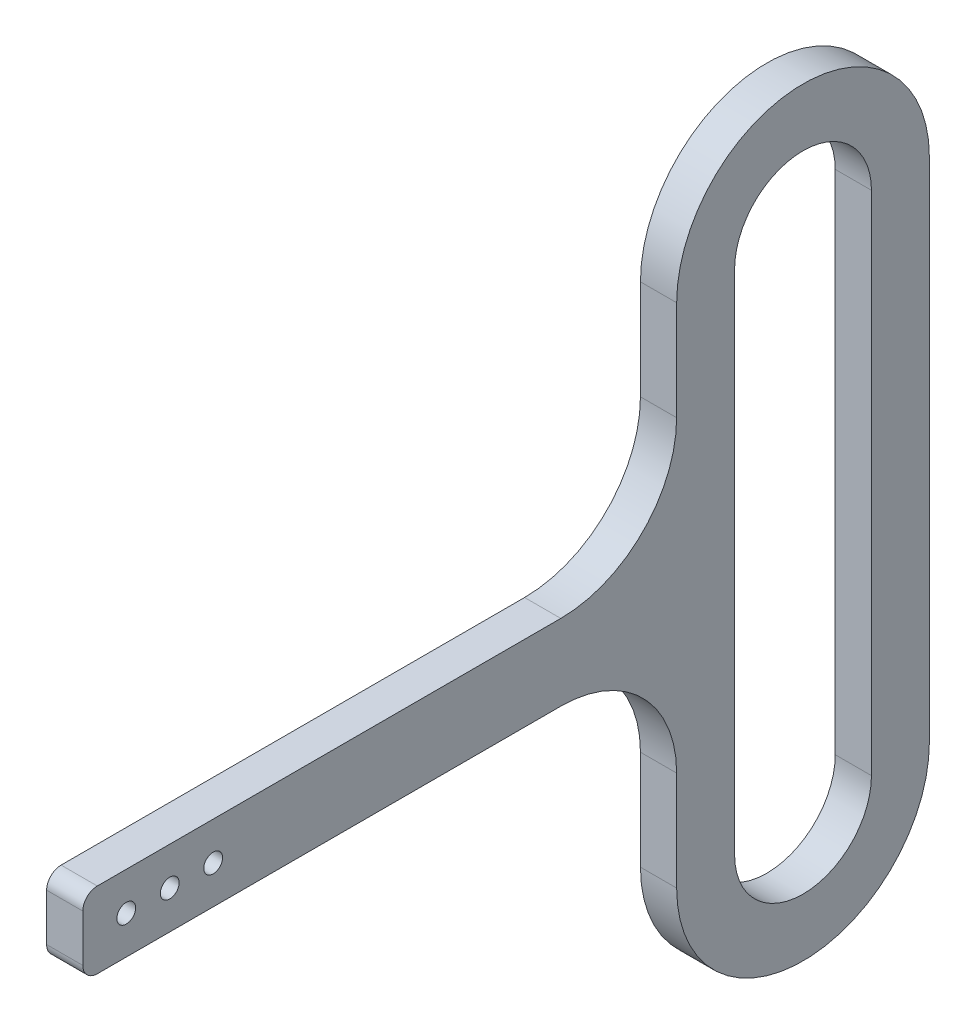
ISO-10303-21;
HEADER;
FILE_DESCRIPTION(('STEP AP214'),'2;1');
FILE_NAME('part.step','',(''),(''),'','','');
FILE_SCHEMA(('AUTOMOTIVE_DESIGN { 1 0 10303 214 1 1 1 1 }'));
ENDSEC;
DATA;
#1=APPLICATION_CONTEXT('core data for automotive mechanical design processes');
#2=APPLICATION_PROTOCOL_DEFINITION('international standard','automotive_design',2000,#1);
#3=PRODUCT_CONTEXT('',#1,'mechanical');
#4=PRODUCT('Part','Part','',(#3));
#5=PRODUCT_RELATED_PRODUCT_CATEGORY('part','',(#4));
#6=PRODUCT_DEFINITION_FORMATION('','',#4);
#7=PRODUCT_DEFINITION_CONTEXT('part definition',#1,'design');
#8=PRODUCT_DEFINITION('design','',#6,#7);
#9=PRODUCT_DEFINITION_SHAPE('','',#8);
#10=(LENGTH_UNIT() NAMED_UNIT(*) SI_UNIT(.MILLI.,.METRE.));
#11=(NAMED_UNIT(*) PLANE_ANGLE_UNIT() SI_UNIT($,.RADIAN.));
#12=(NAMED_UNIT(*) SI_UNIT($,.STERADIAN.) SOLID_ANGLE_UNIT());
#13=UNCERTAINTY_MEASURE_WITH_UNIT(LENGTH_MEASURE(1.E-05),#10,'distance_accuracy_value','');
#14=(GEOMETRIC_REPRESENTATION_CONTEXT(3) GLOBAL_UNCERTAINTY_ASSIGNED_CONTEXT((#13)) GLOBAL_UNIT_ASSIGNED_CONTEXT((#10,
#11,#12)) REPRESENTATION_CONTEXT('',''));
#15=CARTESIAN_POINT('',(0.,0.,0.));
#16=DIRECTION('',(0.,0.,1.));
#17=DIRECTION('',(1.,0.,0.));
#18=AXIS2_PLACEMENT_3D('',#15,#16,#17);
#19=CARTESIAN_POINT('',(6.35,44.45,0.));
#20=DIRECTION('',(-1.,0.,0.));
#21=DIRECTION('',(0.,0.,1.));
#22=AXIS2_PLACEMENT_3D('',#19,#20,#21);
#23=CYLINDRICAL_SURFACE('',#22,12.);
#24=CARTESIAN_POINT('',(0.,44.45,0.));
#25=DIRECTION('',(1.,0.,0.));
#26=DIRECTION('',(0.,0.,-1.));
#27=AXIS2_PLACEMENT_3D('',#24,#25,#26);
#28=CIRCLE('',#27,12.);
#29=CARTESIAN_POINT('',(0.,44.45,-12.));
#30=VERTEX_POINT('',#29);
#31=CARTESIAN_POINT('',(0.,44.45,12.));
#32=VERTEX_POINT('',#31);
#33=EDGE_CURVE('E235',#30,#32,#28,.T.);
#34=ORIENTED_EDGE('',*,*,#33,.F.);
#35=DIRECTION('',(-1.,0.,0.));
#36=VECTOR('',#35,1.);
#37=CARTESIAN_POINT('',(6.35,44.45,-12.));
#38=LINE('',#37,#36);
#39=CARTESIAN_POINT('',(6.35,44.45,-12.));
#40=VERTEX_POINT('',#39);
#41=EDGE_CURVE('E253',#40,#30,#38,.T.);
#42=ORIENTED_EDGE('',*,*,#41,.F.);
#43=CARTESIAN_POINT('',(6.35,44.45,0.));
#44=DIRECTION('',(1.,0.,0.));
#45=DIRECTION('',(0.,0.,-1.));
#46=AXIS2_PLACEMENT_3D('',#43,#44,#45);
#47=CIRCLE('',#46,12.);
#48=CARTESIAN_POINT('',(6.35,44.45,12.));
#49=VERTEX_POINT('',#48);
#50=EDGE_CURVE('E191',#40,#49,#47,.T.);
#51=ORIENTED_EDGE('',*,*,#50,.T.);
#52=DIRECTION('',(-1.,0.,0.));
#53=VECTOR('',#52,1.);
#54=CARTESIAN_POINT('',(6.35,44.45,12.));
#55=LINE('',#54,#53);
#56=EDGE_CURVE('E163',#49,#32,#55,.T.);
#57=ORIENTED_EDGE('',*,*,#56,.T.);
#58=EDGE_LOOP('',(#34,#42,#51,#57));
#59=FACE_BOUND('',#58,.T.);
#60=ADVANCED_FACE('F37',(#59),#23,.F.);
#61=CARTESIAN_POINT('',(6.35,0.,-12.));
#62=DIRECTION('',(0.,0.,1.));
#63=DIRECTION('',(0.,-1.,0.));
#64=AXIS2_PLACEMENT_3D('',#61,#62,#63);
#65=PLANE('',#64);
#66=DIRECTION('',(0.,1.,0.));
#67=VECTOR('',#66,1.);
#68=CARTESIAN_POINT('',(0.,0.,-12.));
#69=LINE('',#68,#67);
#70=CARTESIAN_POINT('',(0.,-44.45,-12.));
#71=VERTEX_POINT('',#70);
#72=EDGE_CURVE('E238',#71,#30,#69,.T.);
#73=ORIENTED_EDGE('',*,*,#72,.F.);
#74=DIRECTION('',(-1.,0.,0.));
#75=VECTOR('',#74,1.);
#76=CARTESIAN_POINT('',(6.35,-44.45,-12.));
#77=LINE('',#76,#75);
#78=CARTESIAN_POINT('',(6.35,-44.45,-12.));
#79=VERTEX_POINT('',#78);
#80=EDGE_CURVE('E251',#79,#71,#77,.T.);
#81=ORIENTED_EDGE('',*,*,#80,.F.);
#82=DIRECTION('',(0.,1.,0.));
#83=VECTOR('',#82,1.);
#84=CARTESIAN_POINT('',(6.35,0.,-12.));
#85=LINE('',#84,#83);
#86=EDGE_CURVE('E199',#79,#40,#85,.T.);
#87=ORIENTED_EDGE('',*,*,#86,.T.);
#88=ORIENTED_EDGE('',*,*,#41,.T.);
#89=EDGE_LOOP('',(#73,#81,#87,#88));
#90=FACE_BOUND('',#89,.T.);
#91=ADVANCED_FACE('F328',(#90),#65,.T.);
#92=CARTESIAN_POINT('',(6.35,-44.45,0.));
#93=DIRECTION('',(-1.,0.,0.));
#94=DIRECTION('',(0.,0.,1.));
#95=AXIS2_PLACEMENT_3D('',#92,#93,#94);
#96=CYLINDRICAL_SURFACE('',#95,12.);
#97=CARTESIAN_POINT('',(0.,-44.45,0.));
#98=DIRECTION('',(1.,0.,0.));
#99=DIRECTION('',(0.,0.,-1.));
#100=AXIS2_PLACEMENT_3D('',#97,#98,#99);
#101=CIRCLE('',#100,12.);
#102=CARTESIAN_POINT('',(0.,-44.45,12.));
#103=VERTEX_POINT('',#102);
#104=EDGE_CURVE('E241',#103,#71,#101,.T.);
#105=ORIENTED_EDGE('',*,*,#104,.F.);
#106=DIRECTION('',(-1.,0.,0.));
#107=VECTOR('',#106,1.);
#108=CARTESIAN_POINT('',(6.35,-44.45,12.));
#109=LINE('',#108,#107);
#110=CARTESIAN_POINT('',(6.35,-44.45,12.));
#111=VERTEX_POINT('',#110);
#112=EDGE_CURVE('E249',#111,#103,#109,.T.);
#113=ORIENTED_EDGE('',*,*,#112,.F.);
#114=CARTESIAN_POINT('',(6.35,-44.45,0.));
#115=DIRECTION('',(1.,0.,0.));
#116=DIRECTION('',(0.,0.,-1.));
#117=AXIS2_PLACEMENT_3D('',#114,#115,#116);
#118=CIRCLE('',#117,12.);
#119=EDGE_CURVE('E202',#111,#79,#118,.T.);
#120=ORIENTED_EDGE('',*,*,#119,.T.);
#121=ORIENTED_EDGE('',*,*,#80,.T.);
#122=EDGE_LOOP('',(#105,#113,#120,#121));
#123=FACE_BOUND('',#122,.T.);
#124=ADVANCED_FACE('F334',(#123),#96,.F.);
#125=CARTESIAN_POINT('',(6.35,0.,126.3));
#126=DIRECTION('',(0.,0.,1.));
#127=DIRECTION('',(1.,0.,0.));
#128=AXIS2_PLACEMENT_3D('',#125,#126,#127);
#129=PLANE('',#128);
#130=DIRECTION('',(0.,1.,0.));
#131=VECTOR('',#130,1.);
#132=CARTESIAN_POINT('',(0.,0.,126.3));
#133=LINE('',#132,#131);
#134=CARTESIAN_POINT('',(0.,-4.12750000000001,126.3));
#135=VERTEX_POINT('',#134);
#136=CARTESIAN_POINT('',(0.,4.12749999999999,126.3));
#137=VERTEX_POINT('',#136);
#138=EDGE_CURVE('E217',#135,#137,#133,.T.);
#139=ORIENTED_EDGE('',*,*,#138,.F.);
#140=DIRECTION('',(-1.,0.,0.));
#141=VECTOR('',#140,1.);
#142=CARTESIAN_POINT('',(6.35,-4.12750000000001,126.3));
#143=LINE('',#142,#141);
#144=CARTESIAN_POINT('',(6.35,-4.12750000000001,126.3));
#145=VERTEX_POINT('',#144);
#146=EDGE_CURVE('E286',#135,#145,#143,.F.);
#147=ORIENTED_EDGE('',*,*,#146,.T.);
#148=DIRECTION('',(0.,1.,0.));
#149=VECTOR('',#148,1.);
#150=CARTESIAN_POINT('',(6.35,0.,126.3));
#151=LINE('',#150,#149);
#152=CARTESIAN_POINT('',(6.35,4.12749999999999,126.3));
#153=VERTEX_POINT('',#152);
#154=EDGE_CURVE('E183',#145,#153,#151,.T.);
#155=ORIENTED_EDGE('',*,*,#154,.T.);
#156=DIRECTION('',(-1.,0.,0.));
#157=VECTOR('',#156,1.);
#158=CARTESIAN_POINT('',(0.,4.12749999999999,126.3));
#159=LINE('',#158,#157);
#160=EDGE_CURVE('E283',#153,#137,#159,.T.);
#161=ORIENTED_EDGE('',*,*,#160,.T.);
#162=EDGE_LOOP('',(#139,#147,#155,#161));
#163=FACE_BOUND('',#162,.T.);
#164=ADVANCED_FACE('F302',(#163),#129,.T.);
#165=CARTESIAN_POINT('',(6.35,-6.66750000000001,0.));
#166=DIRECTION('',(0.,-1.,0.));
#167=DIRECTION('',(0.,0.,-1.));
#168=AXIS2_PLACEMENT_3D('',#165,#166,#167);
#169=PLANE('',#168);
#170=DIRECTION('',(0.,0.,1.));
#171=VECTOR('',#170,1.);
#172=CARTESIAN_POINT('',(6.35,-6.66750000000001,0.));
#173=LINE('',#172,#171);
#174=CARTESIAN_POINT('',(6.35,-6.66750000000001,42.48));
#175=VERTEX_POINT('',#174);
#176=CARTESIAN_POINT('',(6.35,-6.66750000000001,123.76));
#177=VERTEX_POINT('',#176);
#178=EDGE_CURVE('E179',#175,#177,#173,.T.);
#179=ORIENTED_EDGE('',*,*,#178,.T.);
#180=DIRECTION('',(-1.,0.,0.));
#181=VECTOR('',#180,1.);
#182=CARTESIAN_POINT('',(6.35,-6.66750000000001,123.76));
#183=LINE('',#182,#181);
#184=CARTESIAN_POINT('',(0.,-6.66750000000001,123.76));
#185=VERTEX_POINT('',#184);
#186=EDGE_CURVE('E276',#177,#185,#183,.T.);
#187=ORIENTED_EDGE('',*,*,#186,.T.);
#188=DIRECTION('',(0.,0.,1.));
#189=VECTOR('',#188,1.);
#190=CARTESIAN_POINT('',(0.,-6.66750000000001,0.));
#191=LINE('',#190,#189);
#192=CARTESIAN_POINT('',(0.,-6.66750000000001,42.48));
#193=VERTEX_POINT('',#192);
#194=EDGE_CURVE('E220',#193,#185,#191,.T.);
#195=ORIENTED_EDGE('',*,*,#194,.F.);
#196=DIRECTION('',(-1.,0.,0.));
#197=VECTOR('',#196,1.);
#198=CARTESIAN_POINT('',(6.35,-6.66750000000001,42.48));
#199=LINE('',#198,#197);
#200=EDGE_CURVE('E262',#193,#175,#199,.F.);
#201=ORIENTED_EDGE('',*,*,#200,.T.);
#202=EDGE_LOOP('',(#179,#187,#195,#201));
#203=FACE_BOUND('',#202,.T.);
#204=ADVANCED_FACE('F293',(#203),#169,.T.);
#205=CARTESIAN_POINT('',(6.35,0.,22.16));
#206=DIRECTION('',(0.,0.,1.));
#207=DIRECTION('',(0.,-1.,0.));
#208=AXIS2_PLACEMENT_3D('',#205,#206,#207);
#209=PLANE('',#208);
#210=DIRECTION('',(0.,1.,0.));
#211=VECTOR('',#210,1.);
#212=CARTESIAN_POINT('',(6.35,0.,22.16));
#213=LINE('',#212,#211);
#214=CARTESIAN_POINT('',(6.35,-44.45,22.16));
#215=VERTEX_POINT('',#214);
#216=CARTESIAN_POINT('',(6.35,-26.9875,22.16));
#217=VERTEX_POINT('',#216);
#218=EDGE_CURVE('E156',#215,#217,#213,.T.);
#219=ORIENTED_EDGE('',*,*,#218,.T.);
#220=DIRECTION('',(-1.,0.,0.));
#221=VECTOR('',#220,1.);
#222=CARTESIAN_POINT('',(0.,-26.9875,22.16));
#223=LINE('',#222,#221);
#224=CARTESIAN_POINT('',(0.,-26.9875,22.16));
#225=VERTEX_POINT('',#224);
#226=EDGE_CURVE('E255',#217,#225,#223,.T.);
#227=ORIENTED_EDGE('',*,*,#226,.T.);
#228=DIRECTION('',(0.,1.,0.));
#229=VECTOR('',#228,1.);
#230=CARTESIAN_POINT('',(0.,0.,22.16));
#231=LINE('',#230,#229);
#232=CARTESIAN_POINT('',(0.,-44.45,22.16));
#233=VERTEX_POINT('',#232);
#234=EDGE_CURVE('E159',#233,#225,#231,.T.);
#235=ORIENTED_EDGE('',*,*,#234,.F.);
#236=DIRECTION('',(-1.,0.,0.));
#237=VECTOR('',#236,1.);
#238=CARTESIAN_POINT('',(6.35,-44.45,22.16));
#239=LINE('',#238,#237);
#240=EDGE_CURVE('E151',#215,#233,#239,.T.);
#241=ORIENTED_EDGE('',*,*,#240,.F.);
#242=EDGE_LOOP('',(#219,#227,#235,#241));
#243=FACE_BOUND('',#242,.T.);
#244=ADVANCED_FACE('F153',(#243),#209,.T.);
#245=CARTESIAN_POINT('',(6.35,-44.45,0.));
#246=DIRECTION('',(-1.,0.,0.));
#247=DIRECTION('',(0.,0.,1.));
#248=AXIS2_PLACEMENT_3D('',#245,#246,#247);
#249=CYLINDRICAL_SURFACE('',#248,22.16);
#250=CARTESIAN_POINT('',(0.,-44.45,0.));
#251=DIRECTION('',(1.,0.,0.));
#252=DIRECTION('',(0.,0.,-1.));
#253=AXIS2_PLACEMENT_3D('',#250,#251,#252);
#254=CIRCLE('',#253,22.16);
#255=CARTESIAN_POINT('',(0.,-44.45,-22.16));
#256=VERTEX_POINT('',#255);
#257=EDGE_CURVE('E224',#233,#256,#254,.T.);
#258=ORIENTED_EDGE('',*,*,#257,.T.);
#259=DIRECTION('',(-1.,0.,0.));
#260=VECTOR('',#259,1.);
#261=CARTESIAN_POINT('',(6.35,-44.45,-22.16));
#262=LINE('',#261,#260);
#263=CARTESIAN_POINT('',(6.35,-44.45,-22.16));
#264=VERTEX_POINT('',#263);
#265=EDGE_CURVE('E164',#264,#256,#262,.T.);
#266=ORIENTED_EDGE('',*,*,#265,.F.);
#267=CARTESIAN_POINT('',(6.35,-44.45,0.));
#268=DIRECTION('',(1.,0.,0.));
#269=DIRECTION('',(0.,0.,-1.));
#270=AXIS2_PLACEMENT_3D('',#267,#268,#269);
#271=CIRCLE('',#270,22.16);
#272=EDGE_CURVE('E168',#215,#264,#271,.T.);
#273=ORIENTED_EDGE('',*,*,#272,.F.);
#274=ORIENTED_EDGE('',*,*,#240,.T.);
#275=EDGE_LOOP('',(#258,#266,#273,#274));
#276=FACE_BOUND('',#275,.T.);
#277=ADVANCED_FACE('F169',(#276),#249,.T.);
#278=CARTESIAN_POINT('',(6.35,0.,-22.16));
#279=DIRECTION('',(0.,0.,1.));
#280=DIRECTION('',(0.,-1.,0.));
#281=AXIS2_PLACEMENT_3D('',#278,#279,#280);
#282=PLANE('',#281);
#283=DIRECTION('',(0.,1.,0.));
#284=VECTOR('',#283,1.);
#285=CARTESIAN_POINT('',(0.,0.,-22.16));
#286=LINE('',#285,#284);
#287=CARTESIAN_POINT('',(0.,44.45,-22.16));
#288=VERTEX_POINT('',#287);
#289=EDGE_CURVE('E227',#256,#288,#286,.T.);
#290=ORIENTED_EDGE('',*,*,#289,.T.);
#291=DIRECTION('',(-1.,0.,0.));
#292=VECTOR('',#291,1.);
#293=CARTESIAN_POINT('',(6.35,44.45,-22.16));
#294=LINE('',#293,#292);
#295=CARTESIAN_POINT('',(6.35,44.45,-22.16));
#296=VERTEX_POINT('',#295);
#297=EDGE_CURVE('E257',#296,#288,#294,.T.);
#298=ORIENTED_EDGE('',*,*,#297,.F.);
#299=DIRECTION('',(0.,1.,0.));
#300=VECTOR('',#299,1.);
#301=CARTESIAN_POINT('',(6.35,0.,-22.16));
#302=LINE('',#301,#300);
#303=EDGE_CURVE('E172',#264,#296,#302,.T.);
#304=ORIENTED_EDGE('',*,*,#303,.F.);
#305=ORIENTED_EDGE('',*,*,#265,.T.);
#306=EDGE_LOOP('',(#290,#298,#304,#305));
#307=FACE_BOUND('',#306,.T.);
#308=ADVANCED_FACE('F318',(#307),#282,.F.);
#309=CARTESIAN_POINT('',(6.35,44.45,0.));
#310=DIRECTION('',(-1.,0.,0.));
#311=DIRECTION('',(0.,0.,1.));
#312=AXIS2_PLACEMENT_3D('',#309,#310,#311);
#313=CYLINDRICAL_SURFACE('',#312,22.16);
#314=CARTESIAN_POINT('',(0.,44.45,0.));
#315=DIRECTION('',(1.,0.,0.));
#316=DIRECTION('',(0.,0.,-1.));
#317=AXIS2_PLACEMENT_3D('',#314,#315,#316);
#318=CIRCLE('',#317,22.16);
#319=CARTESIAN_POINT('',(0.,44.45,22.16));
#320=VERTEX_POINT('',#319);
#321=EDGE_CURVE('E230',#288,#320,#318,.T.);
#322=ORIENTED_EDGE('',*,*,#321,.T.);
#323=DIRECTION('',(-1.,0.,0.));
#324=VECTOR('',#323,1.);
#325=CARTESIAN_POINT('',(6.35,44.45,22.16));
#326=LINE('',#325,#324);
#327=CARTESIAN_POINT('',(6.35,44.45,22.16));
#328=VERTEX_POINT('',#327);
#329=EDGE_CURVE('E207',#328,#320,#326,.T.);
#330=ORIENTED_EDGE('',*,*,#329,.F.);
#331=CARTESIAN_POINT('',(6.35,44.45,0.));
#332=DIRECTION('',(1.,0.,0.));
#333=DIRECTION('',(0.,0.,-1.));
#334=AXIS2_PLACEMENT_3D('',#331,#332,#333);
#335=CIRCLE('',#334,22.16);
#336=EDGE_CURVE('E186',#296,#328,#335,.T.);
#337=ORIENTED_EDGE('',*,*,#336,.F.);
#338=ORIENTED_EDGE('',*,*,#297,.T.);
#339=EDGE_LOOP('',(#322,#330,#337,#338));
#340=FACE_BOUND('',#339,.T.);
#341=ADVANCED_FACE('F315',(#340),#313,.T.);
#342=CARTESIAN_POINT('',(0.,26.9875,22.16));
#343=VERTEX_POINT('',#342);
#344=EDGE_CURVE('E225',#343,#320,#231,.T.);
#345=ORIENTED_EDGE('',*,*,#344,.F.);
#346=DIRECTION('',(-1.,0.,0.));
#347=VECTOR('',#346,1.);
#348=CARTESIAN_POINT('',(6.35,26.9875,22.16));
#349=LINE('',#348,#347);
#350=CARTESIAN_POINT('',(6.35,26.9875,22.16));
#351=VERTEX_POINT('',#350);
#352=EDGE_CURVE('E267',#343,#351,#349,.F.);
#353=ORIENTED_EDGE('',*,*,#352,.T.);
#354=EDGE_CURVE('E181',#351,#328,#213,.T.);
#355=ORIENTED_EDGE('',*,*,#354,.T.);
#356=ORIENTED_EDGE('',*,*,#329,.T.);
#357=EDGE_LOOP('',(#345,#353,#355,#356));
#358=FACE_BOUND('',#357,.T.);
#359=ADVANCED_FACE('F313',(#358),#209,.T.);
#360=CARTESIAN_POINT('',(6.35,6.66750000000001,0.));
#361=DIRECTION('',(0.,-1.,0.));
#362=DIRECTION('',(0.,0.,-1.));
#363=AXIS2_PLACEMENT_3D('',#360,#361,#362);
#364=PLANE('',#363);
#365=DIRECTION('',(0.,0.,1.));
#366=VECTOR('',#365,1.);
#367=CARTESIAN_POINT('',(0.,6.66750000000001,0.));
#368=LINE('',#367,#366);
#369=CARTESIAN_POINT('',(0.,6.6675,42.48));
#370=VERTEX_POINT('',#369);
#371=CARTESIAN_POINT('',(0.,6.66749999999999,123.76));
#372=VERTEX_POINT('',#371);
#373=EDGE_CURVE('E233',#370,#372,#368,.T.);
#374=ORIENTED_EDGE('',*,*,#373,.T.);
#375=DIRECTION('',(-1.,0.,0.));
#376=VECTOR('',#375,1.);
#377=CARTESIAN_POINT('',(6.35,6.66749999999999,123.76));
#378=LINE('',#377,#376);
#379=CARTESIAN_POINT('',(6.35,6.66749999999999,123.76));
#380=VERTEX_POINT('',#379);
#381=EDGE_CURVE('E11',#372,#380,#378,.F.);
#382=ORIENTED_EDGE('',*,*,#381,.T.);
#383=DIRECTION('',(0.,0.,1.));
#384=VECTOR('',#383,1.);
#385=CARTESIAN_POINT('',(6.35,6.66750000000001,0.));
#386=LINE('',#385,#384);
#387=CARTESIAN_POINT('',(6.35,6.6675,42.48));
#388=VERTEX_POINT('',#387);
#389=EDGE_CURVE('E185',#388,#380,#386,.T.);
#390=ORIENTED_EDGE('',*,*,#389,.F.);
#391=DIRECTION('',(-1.,0.,0.));
#392=VECTOR('',#391,1.);
#393=CARTESIAN_POINT('',(6.35,6.6675,42.48));
#394=LINE('',#393,#392);
#395=EDGE_CURVE('E264',#388,#370,#394,.T.);
#396=ORIENTED_EDGE('',*,*,#395,.T.);
#397=EDGE_LOOP('',(#374,#382,#390,#396));
#398=FACE_BOUND('',#397,.T.);
#399=ADVANCED_FACE('F306',(#398),#364,.F.);
#400=CARTESIAN_POINT('',(6.35,0.,118.68));
#401=DIRECTION('',(-1.,0.,0.));
#402=DIRECTION('',(0.,0.,1.));
#403=AXIS2_PLACEMENT_3D('',#400,#401,#402);
#404=CYLINDRICAL_SURFACE('',#403,1.65100000000001);
#405=CARTESIAN_POINT('',(6.35,0.,118.68));
#406=DIRECTION('',(1.,0.,0.));
#407=DIRECTION('',(0.,0.,-1.));
#408=AXIS2_PLACEMENT_3D('',#405,#406,#407);
#409=CIRCLE('',#408,1.65100000000001);
#410=CARTESIAN_POINT('',(6.35,0.,117.029));
#411=VERTEX_POINT('',#410);
#412=EDGE_CURVE('E531',#411,#411,#409,.T.);
#413=ORIENTED_EDGE('',*,*,#412,.T.);
#414=EDGE_LOOP('',(#413));
#415=FACE_BOUND('',#414,.T.);
#416=CARTESIAN_POINT('',(0.,0.,118.68));
#417=DIRECTION('',(1.,0.,0.));
#418=DIRECTION('',(0.,0.,-1.));
#419=AXIS2_PLACEMENT_3D('',#416,#417,#418);
#420=CIRCLE('',#419,1.65100000000001);
#421=CARTESIAN_POINT('',(0.,0.,117.029));
#422=VERTEX_POINT('',#421);
#423=EDGE_CURVE('E214',#422,#422,#420,.T.);
#424=ORIENTED_EDGE('',*,*,#423,.F.);
#425=EDGE_LOOP('',(#424));
#426=FACE_BOUND('',#425,.T.);
#427=ADVANCED_FACE('F342',(#415,#426),#404,.F.);
#428=CARTESIAN_POINT('',(6.35,0.,111.06));
#429=DIRECTION('',(-1.,0.,0.));
#430=DIRECTION('',(0.,0.,1.));
#431=AXIS2_PLACEMENT_3D('',#428,#429,#430);
#432=CYLINDRICAL_SURFACE('',#431,1.65100000000001);
#433=CARTESIAN_POINT('',(6.35,0.,111.06));
#434=DIRECTION('',(1.,0.,0.));
#435=DIRECTION('',(0.,0.,-1.));
#436=AXIS2_PLACEMENT_3D('',#433,#434,#435);
#437=CIRCLE('',#436,1.65100000000001);
#438=CARTESIAN_POINT('',(6.35,0.,109.409));
#439=VERTEX_POINT('',#438);
#440=EDGE_CURVE('E528',#439,#439,#437,.T.);
#441=ORIENTED_EDGE('',*,*,#440,.T.);
#442=EDGE_LOOP('',(#441));
#443=FACE_BOUND('',#442,.T.);
#444=CARTESIAN_POINT('',(0.,0.,111.06));
#445=DIRECTION('',(1.,0.,0.));
#446=DIRECTION('',(0.,0.,-1.));
#447=AXIS2_PLACEMENT_3D('',#444,#445,#446);
#448=CIRCLE('',#447,1.65100000000001);
#449=CARTESIAN_POINT('',(0.,0.,109.409));
#450=VERTEX_POINT('',#449);
#451=EDGE_CURVE('E211',#450,#450,#448,.T.);
#452=ORIENTED_EDGE('',*,*,#451,.F.);
#453=EDGE_LOOP('',(#452));
#454=FACE_BOUND('',#453,.T.);
#455=ADVANCED_FACE('F358',(#443,#454),#432,.F.);
#456=CARTESIAN_POINT('',(6.35,0.,103.44));
#457=DIRECTION('',(-1.,0.,0.));
#458=DIRECTION('',(0.,0.,1.));
#459=AXIS2_PLACEMENT_3D('',#456,#457,#458);
#460=CYLINDRICAL_SURFACE('',#459,1.65100000000001);
#461=CARTESIAN_POINT('',(6.35,0.,103.44));
#462=DIRECTION('',(1.,0.,0.));
#463=DIRECTION('',(0.,0.,-1.));
#464=AXIS2_PLACEMENT_3D('',#461,#462,#463);
#465=CIRCLE('',#464,1.65100000000001);
#466=CARTESIAN_POINT('',(6.35,0.,101.789));
#467=VERTEX_POINT('',#466);
#468=EDGE_CURVE('E247',#467,#467,#465,.T.);
#469=ORIENTED_EDGE('',*,*,#468,.T.);
#470=EDGE_LOOP('',(#469));
#471=FACE_BOUND('',#470,.T.);
#472=CARTESIAN_POINT('',(0.,0.,103.44));
#473=DIRECTION('',(1.,0.,0.));
#474=DIRECTION('',(0.,0.,-1.));
#475=AXIS2_PLACEMENT_3D('',#472,#473,#474);
#476=CIRCLE('',#475,1.65100000000001);
#477=CARTESIAN_POINT('',(0.,0.,101.789));
#478=VERTEX_POINT('',#477);
#479=EDGE_CURVE('E208',#478,#478,#476,.T.);
#480=ORIENTED_EDGE('',*,*,#479,.F.);
#481=EDGE_LOOP('',(#480));
#482=FACE_BOUND('',#481,.T.);
#483=ADVANCED_FACE('F362',(#471,#482),#460,.F.);
#484=CARTESIAN_POINT('',(6.35,0.,12.));
#485=DIRECTION('',(0.,0.,1.));
#486=DIRECTION('',(0.,-1.,0.));
#487=AXIS2_PLACEMENT_3D('',#484,#485,#486);
#488=PLANE('',#487);
#489=DIRECTION('',(0.,1.,0.));
#490=VECTOR('',#489,1.);
#491=CARTESIAN_POINT('',(0.,0.,12.));
#492=LINE('',#491,#490);
#493=EDGE_CURVE('E244',#103,#32,#492,.T.);
#494=ORIENTED_EDGE('',*,*,#493,.T.);
#495=ORIENTED_EDGE('',*,*,#56,.F.);
#496=DIRECTION('',(0.,1.,0.));
#497=VECTOR('',#496,1.);
#498=CARTESIAN_POINT('',(6.35,0.,12.));
#499=LINE('',#498,#497);
#500=EDGE_CURVE('E205',#111,#49,#499,.T.);
#501=ORIENTED_EDGE('',*,*,#500,.F.);
#502=ORIENTED_EDGE('',*,*,#112,.T.);
#503=EDGE_LOOP('',(#494,#495,#501,#502));
#504=FACE_BOUND('',#503,.T.);
#505=ADVANCED_FACE('F366',(#504),#488,.F.);
#506=CARTESIAN_POINT('',(6.35,0.,0.));
#507=DIRECTION('',(1.,0.,0.));
#508=DIRECTION('',(0.,0.,-1.));
#509=AXIS2_PLACEMENT_3D('',#506,#507,#508);
#510=PLANE('',#509);
#511=ORIENTED_EDGE('',*,*,#468,.F.);
#512=EDGE_LOOP('',(#511));
#513=FACE_BOUND('',#512,.T.);
#514=ORIENTED_EDGE('',*,*,#440,.F.);
#515=EDGE_LOOP('',(#514));
#516=FACE_BOUND('',#515,.T.);
#517=ORIENTED_EDGE('',*,*,#412,.F.);
#518=EDGE_LOOP('',(#517));
#519=FACE_BOUND('',#518,.T.);
#520=ORIENTED_EDGE('',*,*,#154,.F.);
#521=CARTESIAN_POINT('',(6.35,-4.12750000000001,123.76));
#522=DIRECTION('',(1.,0.,0.));
#523=DIRECTION('',(0.,0.,-1.));
#524=AXIS2_PLACEMENT_3D('',#521,#522,#523);
#525=CIRCLE('',#524,2.54);
#526=EDGE_CURVE('E45',#145,#177,#525,.T.);
#527=ORIENTED_EDGE('',*,*,#526,.T.);
#528=ORIENTED_EDGE('',*,*,#178,.F.);
#529=CARTESIAN_POINT('',(6.35,-26.9875,42.48));
#530=DIRECTION('',(1.,0.,0.));
#531=DIRECTION('',(0.,0.,-1.));
#532=AXIS2_PLACEMENT_3D('',#529,#530,#531);
#533=CIRCLE('',#532,20.32);
#534=EDGE_CURVE('E178',#175,#217,#533,.F.);
#535=ORIENTED_EDGE('',*,*,#534,.T.);
#536=ORIENTED_EDGE('',*,*,#218,.F.);
#537=ORIENTED_EDGE('',*,*,#272,.T.);
#538=ORIENTED_EDGE('',*,*,#303,.T.);
#539=ORIENTED_EDGE('',*,*,#336,.T.);
#540=ORIENTED_EDGE('',*,*,#354,.F.);
#541=CARTESIAN_POINT('',(6.35,26.9875,42.48));
#542=DIRECTION('',(1.,0.,0.));
#543=DIRECTION('',(0.,0.,-1.));
#544=AXIS2_PLACEMENT_3D('',#541,#542,#543);
#545=CIRCLE('',#544,20.32);
#546=EDGE_CURVE('E274',#351,#388,#545,.F.);
#547=ORIENTED_EDGE('',*,*,#546,.T.);
#548=ORIENTED_EDGE('',*,*,#389,.T.);
#549=CARTESIAN_POINT('',(6.35,4.12749999999999,123.76));
#550=DIRECTION('',(1.,0.,0.));
#551=DIRECTION('',(0.,0.,-1.));
#552=AXIS2_PLACEMENT_3D('',#549,#550,#551);
#553=CIRCLE('',#552,2.54);
#554=EDGE_CURVE('E57',#380,#153,#553,.T.);
#555=ORIENTED_EDGE('',*,*,#554,.T.);
#556=EDGE_LOOP('',(#520,#527,#528,#535,#536,#537,#538,#539,#540,#547,#548,#555));
#557=FACE_BOUND('',#556,.T.);
#558=ORIENTED_EDGE('',*,*,#50,.F.);
#559=ORIENTED_EDGE('',*,*,#86,.F.);
#560=ORIENTED_EDGE('',*,*,#119,.F.);
#561=ORIENTED_EDGE('',*,*,#500,.T.);
#562=EDGE_LOOP('',(#558,#559,#560,#561));
#563=FACE_BOUND('',#562,.T.);
#564=ADVANCED_FACE('F174',(#513,#516,#519,#557,#563),#510,.T.);
#565=CARTESIAN_POINT('',(0.,0.,0.));
#566=DIRECTION('',(1.,0.,0.));
#567=DIRECTION('',(0.,0.,-1.));
#568=AXIS2_PLACEMENT_3D('',#565,#566,#567);
#569=PLANE('',#568);
#570=ORIENTED_EDGE('',*,*,#479,.T.);
#571=EDGE_LOOP('',(#570));
#572=FACE_BOUND('',#571,.T.);
#573=ORIENTED_EDGE('',*,*,#451,.T.);
#574=EDGE_LOOP('',(#573));
#575=FACE_BOUND('',#574,.T.);
#576=ORIENTED_EDGE('',*,*,#423,.T.);
#577=EDGE_LOOP('',(#576));
#578=FACE_BOUND('',#577,.T.);
#579=ORIENTED_EDGE('',*,*,#194,.T.);
#580=CARTESIAN_POINT('',(0.,-4.12750000000001,123.76));
#581=DIRECTION('',(1.,0.,0.));
#582=DIRECTION('',(0.,0.,-1.));
#583=AXIS2_PLACEMENT_3D('',#580,#581,#582);
#584=CIRCLE('',#583,2.54);
#585=EDGE_CURVE('E281',#185,#135,#584,.F.);
#586=ORIENTED_EDGE('',*,*,#585,.T.);
#587=ORIENTED_EDGE('',*,*,#138,.T.);
#588=CARTESIAN_POINT('',(0.,4.12749999999999,123.76));
#589=DIRECTION('',(1.,0.,0.));
#590=DIRECTION('',(0.,0.,-1.));
#591=AXIS2_PLACEMENT_3D('',#588,#589,#590);
#592=CIRCLE('',#591,2.54);
#593=EDGE_CURVE('E279',#137,#372,#592,.F.);
#594=ORIENTED_EDGE('',*,*,#593,.T.);
#595=ORIENTED_EDGE('',*,*,#373,.F.);
#596=CARTESIAN_POINT('',(0.,26.9875,42.48));
#597=DIRECTION('',(1.,0.,0.));
#598=DIRECTION('',(0.,0.,-1.));
#599=AXIS2_PLACEMENT_3D('',#596,#597,#598);
#600=CIRCLE('',#599,20.32);
#601=EDGE_CURVE('E272',#370,#343,#600,.T.);
#602=ORIENTED_EDGE('',*,*,#601,.T.);
#603=ORIENTED_EDGE('',*,*,#344,.T.);
#604=ORIENTED_EDGE('',*,*,#321,.F.);
#605=ORIENTED_EDGE('',*,*,#289,.F.);
#606=ORIENTED_EDGE('',*,*,#257,.F.);
#607=ORIENTED_EDGE('',*,*,#234,.T.);
#608=CARTESIAN_POINT('',(0.,-26.9875,42.48));
#609=DIRECTION('',(1.,0.,0.));
#610=DIRECTION('',(0.,0.,-1.));
#611=AXIS2_PLACEMENT_3D('',#608,#609,#610);
#612=CIRCLE('',#611,20.32);
#613=EDGE_CURVE('E269',#225,#193,#612,.T.);
#614=ORIENTED_EDGE('',*,*,#613,.T.);
#615=EDGE_LOOP('',(#579,#586,#587,#594,#595,#602,#603,#604,#605,#606,#607,#614));
#616=FACE_BOUND('',#615,.T.);
#617=ORIENTED_EDGE('',*,*,#33,.T.);
#618=ORIENTED_EDGE('',*,*,#493,.F.);
#619=ORIENTED_EDGE('',*,*,#104,.T.);
#620=ORIENTED_EDGE('',*,*,#72,.T.);
#621=EDGE_LOOP('',(#617,#618,#619,#620));
#622=FACE_BOUND('',#621,.T.);
#623=ADVANCED_FACE('F299',(#572,#575,#578,#616,#622),#569,.F.);
#624=CARTESIAN_POINT('',(6.35,-26.9875,42.48));
#625=DIRECTION('',(1.,0.,0.));
#626=DIRECTION('',(0.,0.,-1.));
#627=AXIS2_PLACEMENT_3D('',#624,#625,#626);
#628=CYLINDRICAL_SURFACE('',#627,20.32);
#629=ORIENTED_EDGE('',*,*,#534,.F.);
#630=ORIENTED_EDGE('',*,*,#200,.F.);
#631=ORIENTED_EDGE('',*,*,#613,.F.);
#632=ORIENTED_EDGE('',*,*,#226,.F.);
#633=EDGE_LOOP('',(#629,#630,#631,#632));
#634=FACE_BOUND('',#633,.T.);
#635=ADVANCED_FACE('F368',(#634),#628,.F.);
#636=CARTESIAN_POINT('',(6.35,26.9875,42.48));
#637=DIRECTION('',(-1.,0.,0.));
#638=DIRECTION('',(0.,0.,1.));
#639=AXIS2_PLACEMENT_3D('',#636,#637,#638);
#640=CYLINDRICAL_SURFACE('',#639,20.32);
#641=ORIENTED_EDGE('',*,*,#546,.F.);
#642=ORIENTED_EDGE('',*,*,#352,.F.);
#643=ORIENTED_EDGE('',*,*,#601,.F.);
#644=ORIENTED_EDGE('',*,*,#395,.F.);
#645=EDGE_LOOP('',(#641,#642,#643,#644));
#646=FACE_BOUND('',#645,.T.);
#647=ADVANCED_FACE('F310',(#646),#640,.F.);
#648=CARTESIAN_POINT('',(6.35,-4.12750000000001,123.76));
#649=DIRECTION('',(-1.,0.,0.));
#650=DIRECTION('',(0.,0.,1.));
#651=AXIS2_PLACEMENT_3D('',#648,#649,#650);
#652=CYLINDRICAL_SURFACE('',#651,2.54);
#653=ORIENTED_EDGE('',*,*,#526,.F.);
#654=ORIENTED_EDGE('',*,*,#146,.F.);
#655=ORIENTED_EDGE('',*,*,#585,.F.);
#656=ORIENTED_EDGE('',*,*,#186,.F.);
#657=EDGE_LOOP('',(#653,#654,#655,#656));
#658=FACE_BOUND('',#657,.T.);
#659=ADVANCED_FACE('F296',(#658),#652,.T.);
#660=CARTESIAN_POINT('',(6.35,4.12749999999999,123.76));
#661=DIRECTION('',(1.,0.,0.));
#662=DIRECTION('',(0.,0.,-1.));
#663=AXIS2_PLACEMENT_3D('',#660,#661,#662);
#664=CYLINDRICAL_SURFACE('',#663,2.54);
#665=ORIENTED_EDGE('',*,*,#554,.F.);
#666=ORIENTED_EDGE('',*,*,#381,.F.);
#667=ORIENTED_EDGE('',*,*,#593,.F.);
#668=ORIENTED_EDGE('',*,*,#160,.F.);
#669=EDGE_LOOP('',(#665,#666,#667,#668));
#670=FACE_BOUND('',#669,.T.);
#671=ADVANCED_FACE('F39',(#670),#664,.T.);
#672=CLOSED_SHELL('',(#60,#91,#124,#164,#204,#244,#277,#308,#341,#359,#399,#427,#455,#483,#505,
#564,#623,#635,#647,#659,#671));
#673=MANIFOLD_SOLID_BREP('B2',#672);
#674=ADVANCED_BREP_SHAPE_REPRESENTATION('',(#18,#673),#14);
#675=SHAPE_DEFINITION_REPRESENTATION(#9,#674);
ENDSEC;
END-ISO-10303-21;
